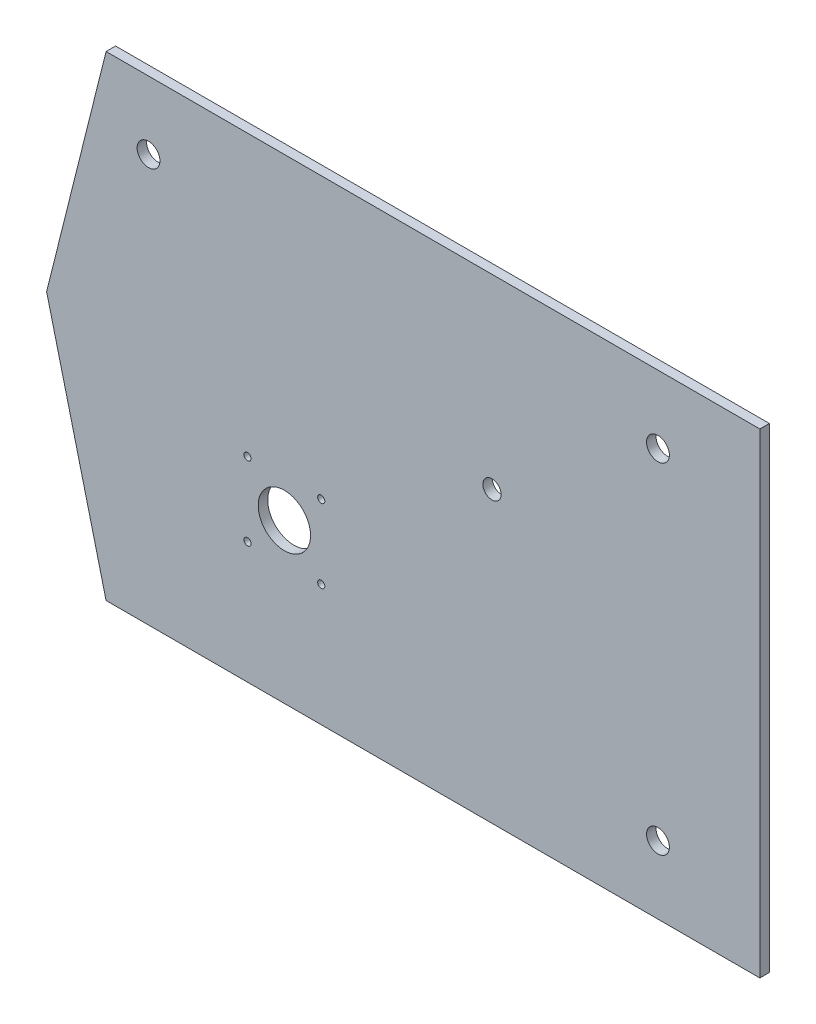
ISO-10303-21;
HEADER;
FILE_DESCRIPTION(('STEP AP214'),'2;1');
FILE_NAME('part.step','',(''),(''),'','','');
FILE_SCHEMA(('AUTOMOTIVE_DESIGN { 1 0 10303 214 1 1 1 1 }'));
ENDSEC;
DATA;
#1=APPLICATION_CONTEXT('core data for automotive mechanical design processes');
#2=APPLICATION_PROTOCOL_DEFINITION('international standard','automotive_design',2000,#1);
#3=PRODUCT_CONTEXT('',#1,'mechanical');
#4=PRODUCT('Part','Part','',(#3));
#5=PRODUCT_RELATED_PRODUCT_CATEGORY('part','',(#4));
#6=PRODUCT_DEFINITION_FORMATION('','',#4);
#7=PRODUCT_DEFINITION_CONTEXT('part definition',#1,'design');
#8=PRODUCT_DEFINITION('design','',#6,#7);
#9=PRODUCT_DEFINITION_SHAPE('','',#8);
#10=(LENGTH_UNIT() NAMED_UNIT(*) SI_UNIT(.MILLI.,.METRE.));
#11=(NAMED_UNIT(*) PLANE_ANGLE_UNIT() SI_UNIT($,.RADIAN.));
#12=(NAMED_UNIT(*) SI_UNIT($,.STERADIAN.) SOLID_ANGLE_UNIT());
#13=UNCERTAINTY_MEASURE_WITH_UNIT(LENGTH_MEASURE(1.E-05),#10,'distance_accuracy_value','');
#14=(GEOMETRIC_REPRESENTATION_CONTEXT(3) GLOBAL_UNCERTAINTY_ASSIGNED_CONTEXT((#13)) GLOBAL_UNIT_ASSIGNED_CONTEXT((#10,
#11,#12)) REPRESENTATION_CONTEXT('',''));
#15=CARTESIAN_POINT('',(0.,0.,0.));
#16=DIRECTION('',(0.,0.,1.));
#17=DIRECTION('',(1.,0.,0.));
#18=AXIS2_PLACEMENT_3D('',#15,#16,#17);
#19=CARTESIAN_POINT('',(-141.176470588235,35.2941176470588,4.));
#20=DIRECTION('',(-0.970142500145332,0.242535625036333,0.));
#21=DIRECTION('',(-0.242535625036333,-0.970142500145332,0.));
#22=AXIS2_PLACEMENT_3D('',#19,#20,#21);
#23=PLANE('',#22);
#24=DIRECTION('',(0.242535625036333,0.970142500145332,0.));
#25=VECTOR('',#24,1.);
#26=CARTESIAN_POINT('',(-141.176470588235,35.2941176470588,0.));
#27=LINE('',#26,#25);
#28=CARTESIAN_POINT('',(-150.,0.,0.));
#29=VERTEX_POINT('',#28);
#30=CARTESIAN_POINT('',(-125.,99.9999999999999,0.));
#31=VERTEX_POINT('',#30);
#32=EDGE_CURVE('E125',#29,#31,#27,.T.);
#33=ORIENTED_EDGE('',*,*,#32,.F.);
#34=DIRECTION('',(0.,0.,-1.));
#35=VECTOR('',#34,1.);
#36=CARTESIAN_POINT('',(-150.,0.,4.));
#37=LINE('',#36,#35);
#38=CARTESIAN_POINT('',(-150.,0.,4.));
#39=VERTEX_POINT('',#38);
#40=EDGE_CURVE('E11',#39,#29,#37,.T.);
#41=ORIENTED_EDGE('',*,*,#40,.F.);
#42=DIRECTION('',(0.242535625036333,0.970142500145332,0.));
#43=VECTOR('',#42,1.);
#44=CARTESIAN_POINT('',(-141.176470588235,35.2941176470588,4.));
#45=LINE('',#44,#43);
#46=CARTESIAN_POINT('',(-125.,99.9999999999999,4.));
#47=VERTEX_POINT('',#46);
#48=EDGE_CURVE('E110',#39,#47,#45,.T.);
#49=ORIENTED_EDGE('',*,*,#48,.T.);
#50=DIRECTION('',(0.,0.,-1.));
#51=VECTOR('',#50,1.);
#52=CARTESIAN_POINT('',(-125.,99.9999999999999,4.));
#53=LINE('',#52,#51);
#54=EDGE_CURVE('E79',#47,#31,#53,.T.);
#55=ORIENTED_EDGE('',*,*,#54,.T.);
#56=EDGE_LOOP('',(#33,#41,#49,#55));
#57=FACE_BOUND('',#56,.T.);
#58=ADVANCED_FACE('F36',(#57),#23,.T.);
#59=CARTESIAN_POINT('',(-141.176470588235,-35.2941176470588,4.));
#60=DIRECTION('',(-0.970142500145332,-0.242535625036333,0.));
#61=DIRECTION('',(0.242535625036333,-0.970142500145332,0.));
#62=AXIS2_PLACEMENT_3D('',#59,#60,#61);
#63=PLANE('',#62);
#64=DIRECTION('',(-0.242535625036333,0.970142500145332,0.));
#65=VECTOR('',#64,1.);
#66=CARTESIAN_POINT('',(-141.176470588235,-35.2941176470588,0.));
#67=LINE('',#66,#65);
#68=CARTESIAN_POINT('',(-125.,-100.,0.));
#69=VERTEX_POINT('',#68);
#70=EDGE_CURVE('E127',#69,#29,#67,.T.);
#71=ORIENTED_EDGE('',*,*,#70,.F.);
#72=DIRECTION('',(0.,0.,-1.));
#73=VECTOR('',#72,1.);
#74=CARTESIAN_POINT('',(-125.,-100.,4.));
#75=LINE('',#74,#73);
#76=CARTESIAN_POINT('',(-125.,-100.,4.));
#77=VERTEX_POINT('',#76);
#78=EDGE_CURVE('E45',#77,#69,#75,.T.);
#79=ORIENTED_EDGE('',*,*,#78,.F.);
#80=DIRECTION('',(-0.242535625036333,0.970142500145332,0.));
#81=VECTOR('',#80,1.);
#82=CARTESIAN_POINT('',(-141.176470588235,-35.2941176470588,4.));
#83=LINE('',#82,#81);
#84=EDGE_CURVE('E108',#77,#39,#83,.T.);
#85=ORIENTED_EDGE('',*,*,#84,.T.);
#86=ORIENTED_EDGE('',*,*,#40,.T.);
#87=EDGE_LOOP('',(#71,#79,#85,#86));
#88=FACE_BOUND('',#87,.T.);
#89=ADVANCED_FACE('F138',(#88),#63,.T.);
#90=CARTESIAN_POINT('',(0.,-100.,4.));
#91=DIRECTION('',(0.,-1.,0.));
#92=DIRECTION('',(1.,0.,0.));
#93=AXIS2_PLACEMENT_3D('',#90,#91,#92);
#94=PLANE('',#93);
#95=DIRECTION('',(-1.,0.,0.));
#96=VECTOR('',#95,1.);
#97=CARTESIAN_POINT('',(0.,-100.,0.));
#98=LINE('',#97,#96);
#99=CARTESIAN_POINT('',(150.,-100.,0.));
#100=VERTEX_POINT('',#99);
#101=EDGE_CURVE('E95',#100,#69,#98,.T.);
#102=ORIENTED_EDGE('',*,*,#101,.F.);
#103=DIRECTION('',(0.,0.,-1.));
#104=VECTOR('',#103,1.);
#105=CARTESIAN_POINT('',(150.,-100.,4.));
#106=LINE('',#105,#104);
#107=CARTESIAN_POINT('',(150.,-100.,4.));
#108=VERTEX_POINT('',#107);
#109=EDGE_CURVE('E89',#108,#100,#106,.T.);
#110=ORIENTED_EDGE('',*,*,#109,.F.);
#111=DIRECTION('',(-1.,0.,0.));
#112=VECTOR('',#111,1.);
#113=CARTESIAN_POINT('',(0.,-100.,4.));
#114=LINE('',#113,#112);
#115=EDGE_CURVE('E93',#108,#77,#114,.T.);
#116=ORIENTED_EDGE('',*,*,#115,.T.);
#117=ORIENTED_EDGE('',*,*,#78,.T.);
#118=EDGE_LOOP('',(#102,#110,#116,#117));
#119=FACE_BOUND('',#118,.T.);
#120=ADVANCED_FACE('F91',(#119),#94,.T.);
#121=CARTESIAN_POINT('',(150.,0.,4.));
#122=DIRECTION('',(-1.,0.,0.));
#123=DIRECTION('',(0.,-1.,0.));
#124=AXIS2_PLACEMENT_3D('',#121,#122,#123);
#125=PLANE('',#124);
#126=DIRECTION('',(0.,1.,0.));
#127=VECTOR('',#126,1.);
#128=CARTESIAN_POINT('',(150.,0.,0.));
#129=LINE('',#128,#127);
#130=CARTESIAN_POINT('',(150.,100.,0.));
#131=VERTEX_POINT('',#130);
#132=EDGE_CURVE('E131',#100,#131,#129,.T.);
#133=ORIENTED_EDGE('',*,*,#132,.T.);
#134=DIRECTION('',(0.,0.,-1.));
#135=VECTOR('',#134,1.);
#136=CARTESIAN_POINT('',(150.,100.,4.));
#137=LINE('',#136,#135);
#138=CARTESIAN_POINT('',(150.,100.,4.));
#139=VERTEX_POINT('',#138);
#140=EDGE_CURVE('E98',#139,#131,#137,.T.);
#141=ORIENTED_EDGE('',*,*,#140,.F.);
#142=DIRECTION('',(0.,1.,0.));
#143=VECTOR('',#142,1.);
#144=CARTESIAN_POINT('',(150.,0.,4.));
#145=LINE('',#144,#143);
#146=EDGE_CURVE('E101',#108,#139,#145,.T.);
#147=ORIENTED_EDGE('',*,*,#146,.F.);
#148=ORIENTED_EDGE('',*,*,#109,.T.);
#149=EDGE_LOOP('',(#133,#141,#147,#148));
#150=FACE_BOUND('',#149,.T.);
#151=ADVANCED_FACE('F102',(#150),#125,.F.);
#152=CARTESIAN_POINT('',(107.142857142857,71.4285714285714,4.));
#153=DIRECTION('',(0.,0.,-1.));
#154=DIRECTION('',(-1.,0.,0.));
#155=AXIS2_PLACEMENT_3D('',#152,#153,#154);
#156=CYLINDRICAL_SURFACE('',#155,4.8);
#157=CARTESIAN_POINT('',(107.142857142857,71.4285714285714,4.));
#158=DIRECTION('',(0.,0.,1.));
#159=DIRECTION('',(1.,0.,0.));
#160=AXIS2_PLACEMENT_3D('',#157,#158,#159);
#161=CIRCLE('',#160,4.8);
#162=CARTESIAN_POINT('',(111.942857142857,71.4285714285714,4.));
#163=VERTEX_POINT('',#162);
#164=EDGE_CURVE('E198',#163,#163,#161,.T.);
#165=ORIENTED_EDGE('',*,*,#164,.T.);
#166=EDGE_LOOP('',(#165));
#167=FACE_BOUND('',#166,.T.);
#168=CARTESIAN_POINT('',(107.142857142857,71.4285714285714,0.));
#169=DIRECTION('',(0.,0.,1.));
#170=DIRECTION('',(1.,0.,0.));
#171=AXIS2_PLACEMENT_3D('',#168,#169,#170);
#172=CIRCLE('',#171,4.8);
#173=CARTESIAN_POINT('',(111.942857142857,71.4285714285714,0.));
#174=VERTEX_POINT('',#173);
#175=EDGE_CURVE('E122',#174,#174,#172,.T.);
#176=ORIENTED_EDGE('',*,*,#175,.F.);
#177=EDGE_LOOP('',(#176));
#178=FACE_BOUND('',#177,.T.);
#179=ADVANCED_FACE('F208',(#167,#178),#156,.F.);
#180=CARTESIAN_POINT('',(107.142857142857,-71.4285714285714,4.));
#181=DIRECTION('',(0.,0.,-1.));
#182=DIRECTION('',(-1.,0.,0.));
#183=AXIS2_PLACEMENT_3D('',#180,#181,#182);
#184=CYLINDRICAL_SURFACE('',#183,4.8);
#185=CARTESIAN_POINT('',(107.142857142857,-71.4285714285714,4.));
#186=DIRECTION('',(0.,0.,1.));
#187=DIRECTION('',(1.,0.,0.));
#188=AXIS2_PLACEMENT_3D('',#185,#186,#187);
#189=CIRCLE('',#188,4.8);
#190=CARTESIAN_POINT('',(111.942857142857,-71.4285714285714,4.));
#191=VERTEX_POINT('',#190);
#192=EDGE_CURVE('E195',#191,#191,#189,.T.);
#193=ORIENTED_EDGE('',*,*,#192,.T.);
#194=EDGE_LOOP('',(#193));
#195=FACE_BOUND('',#194,.T.);
#196=CARTESIAN_POINT('',(107.142857142857,-71.4285714285714,0.));
#197=DIRECTION('',(0.,0.,1.));
#198=DIRECTION('',(1.,0.,0.));
#199=AXIS2_PLACEMENT_3D('',#196,#197,#198);
#200=CIRCLE('',#199,4.8);
#201=CARTESIAN_POINT('',(111.942857142857,-71.4285714285714,0.));
#202=VERTEX_POINT('',#201);
#203=EDGE_CURVE('E118',#202,#202,#200,.T.);
#204=ORIENTED_EDGE('',*,*,#203,.F.);
#205=EDGE_LOOP('',(#204));
#206=FACE_BOUND('',#205,.T.);
#207=ADVANCED_FACE('F210',(#195,#206),#184,.F.);
#208=CARTESIAN_POINT('',(-107.142857142857,71.4285714285713,4.));
#209=DIRECTION('',(0.,0.,-1.));
#210=DIRECTION('',(-1.,0.,0.));
#211=AXIS2_PLACEMENT_3D('',#208,#209,#210);
#212=CYLINDRICAL_SURFACE('',#211,4.8);
#213=CARTESIAN_POINT('',(-107.142857142857,71.4285714285713,4.));
#214=DIRECTION('',(0.,0.,1.));
#215=DIRECTION('',(1.,0.,0.));
#216=AXIS2_PLACEMENT_3D('',#213,#214,#215);
#217=CIRCLE('',#216,4.8);
#218=CARTESIAN_POINT('',(-102.342857142857,71.4285714285713,4.));
#219=VERTEX_POINT('',#218);
#220=EDGE_CURVE('E134',#219,#219,#217,.T.);
#221=ORIENTED_EDGE('',*,*,#220,.T.);
#222=EDGE_LOOP('',(#221));
#223=FACE_BOUND('',#222,.T.);
#224=CARTESIAN_POINT('',(-107.142857142857,71.4285714285713,0.));
#225=DIRECTION('',(0.,0.,1.));
#226=DIRECTION('',(1.,0.,0.));
#227=AXIS2_PLACEMENT_3D('',#224,#225,#226);
#228=CIRCLE('',#227,4.8);
#229=CARTESIAN_POINT('',(-102.342857142857,71.4285714285713,0.));
#230=VERTEX_POINT('',#229);
#231=EDGE_CURVE('E115',#230,#230,#228,.T.);
#232=ORIENTED_EDGE('',*,*,#231,.F.);
#233=EDGE_LOOP('',(#232));
#234=FACE_BOUND('',#233,.T.);
#235=ADVANCED_FACE('F38',(#223,#234),#212,.F.);
#236=CARTESIAN_POINT('',(0.,100.,4.));
#237=DIRECTION('',(0.,-1.,0.));
#238=DIRECTION('',(1.,0.,0.));
#239=AXIS2_PLACEMENT_3D('',#236,#237,#238);
#240=PLANE('',#239);
#241=DIRECTION('',(-1.,0.,0.));
#242=VECTOR('',#241,1.);
#243=CARTESIAN_POINT('',(0.,100.,0.));
#244=LINE('',#243,#242);
#245=EDGE_CURVE('E72',#131,#31,#244,.T.);
#246=ORIENTED_EDGE('',*,*,#245,.T.);
#247=ORIENTED_EDGE('',*,*,#54,.F.);
#248=DIRECTION('',(-1.,0.,0.));
#249=VECTOR('',#248,1.);
#250=CARTESIAN_POINT('',(0.,100.,4.));
#251=LINE('',#250,#249);
#252=EDGE_CURVE('E53',#139,#47,#251,.T.);
#253=ORIENTED_EDGE('',*,*,#252,.F.);
#254=ORIENTED_EDGE('',*,*,#140,.T.);
#255=EDGE_LOOP('',(#246,#247,#253,#254));
#256=FACE_BOUND('',#255,.T.);
#257=ADVANCED_FACE('F217',(#256),#240,.F.);
#258=CARTESIAN_POINT('',(0.,0.,4.));
#259=DIRECTION('',(0.,0.,1.));
#260=DIRECTION('',(1.,0.,0.));
#261=AXIS2_PLACEMENT_3D('',#258,#259,#260);
#262=PLANE('',#261);
#263=ORIENTED_EDGE('',*,*,#220,.F.);
#264=EDGE_LOOP('',(#263));
#265=FACE_BOUND('',#264,.T.);
#266=ORIENTED_EDGE('',*,*,#192,.F.);
#267=EDGE_LOOP('',(#266));
#268=FACE_BOUND('',#267,.T.);
#269=ORIENTED_EDGE('',*,*,#164,.F.);
#270=EDGE_LOOP('',(#269));
#271=FACE_BOUND('',#270,.T.);
#272=ORIENTED_EDGE('',*,*,#48,.F.);
#273=ORIENTED_EDGE('',*,*,#84,.F.);
#274=ORIENTED_EDGE('',*,*,#115,.F.);
#275=ORIENTED_EDGE('',*,*,#146,.T.);
#276=ORIENTED_EDGE('',*,*,#252,.T.);
#277=EDGE_LOOP('',(#272,#273,#274,#275,#276));
#278=FACE_BOUND('',#277,.T.);
#279=CARTESIAN_POINT('',(-50.,-33.3333333333334,4.));
#280=DIRECTION('',(0.,0.,1.));
#281=DIRECTION('',(1.,0.,0.));
#282=AXIS2_PLACEMENT_3D('',#279,#280,#281);
#283=CIRCLE('',#282,11.);
#284=CARTESIAN_POINT('',(-39.,-33.3333333333334,4.));
#285=VERTEX_POINT('',#284);
#286=EDGE_CURVE('E174',#285,#285,#283,.T.);
#287=ORIENTED_EDGE('',*,*,#286,.F.);
#288=EDGE_LOOP('',(#287));
#289=FACE_BOUND('',#288,.T.);
#290=CARTESIAN_POINT('',(-65.5000000000001,-48.8333333333333,4.));
#291=DIRECTION('',(0.,0.,1.));
#292=DIRECTION('',(1.,0.,0.));
#293=AXIS2_PLACEMENT_3D('',#290,#291,#292);
#294=CIRCLE('',#293,1.50000000000003);
#295=CARTESIAN_POINT('',(-64.,-48.8333333333333,4.));
#296=VERTEX_POINT('',#295);
#297=EDGE_CURVE('E177',#296,#296,#294,.T.);
#298=ORIENTED_EDGE('',*,*,#297,.F.);
#299=EDGE_LOOP('',(#298));
#300=FACE_BOUND('',#299,.T.);
#301=CARTESIAN_POINT('',(-34.5,-48.8333333333333,4.));
#302=DIRECTION('',(0.,0.,1.));
#303=DIRECTION('',(1.,0.,0.));
#304=AXIS2_PLACEMENT_3D('',#301,#302,#303);
#305=CIRCLE('',#304,1.50000000000003);
#306=CARTESIAN_POINT('',(-33.,-48.8333333333333,4.));
#307=VERTEX_POINT('',#306);
#308=EDGE_CURVE('E180',#307,#307,#305,.T.);
#309=ORIENTED_EDGE('',*,*,#308,.F.);
#310=EDGE_LOOP('',(#309));
#311=FACE_BOUND('',#310,.T.);
#312=CARTESIAN_POINT('',(-34.5,-17.8333333333333,4.));
#313=DIRECTION('',(0.,0.,1.));
#314=DIRECTION('',(1.,0.,0.));
#315=AXIS2_PLACEMENT_3D('',#312,#313,#314);
#316=CIRCLE('',#315,1.50000000000003);
#317=CARTESIAN_POINT('',(-33.,-17.8333333333333,4.));
#318=VERTEX_POINT('',#317);
#319=EDGE_CURVE('E183',#318,#318,#316,.T.);
#320=ORIENTED_EDGE('',*,*,#319,.F.);
#321=EDGE_LOOP('',(#320));
#322=FACE_BOUND('',#321,.T.);
#323=CARTESIAN_POINT('',(-65.5000000000001,-17.8333333333333,4.));
#324=DIRECTION('',(0.,0.,1.));
#325=DIRECTION('',(1.,0.,0.));
#326=AXIS2_PLACEMENT_3D('',#323,#324,#325);
#327=CIRCLE('',#326,1.50000000000003);
#328=CARTESIAN_POINT('',(-64.,-17.8333333333333,4.));
#329=VERTEX_POINT('',#328);
#330=EDGE_CURVE('E119',#329,#329,#327,.T.);
#331=ORIENTED_EDGE('',*,*,#330,.F.);
#332=EDGE_LOOP('',(#331));
#333=FACE_BOUND('',#332,.T.);
#334=CARTESIAN_POINT('',(37.332408691632,21.6520265063954,4.));
#335=DIRECTION('',(0.,0.,1.));
#336=DIRECTION('',(1.,0.,0.));
#337=AXIS2_PLACEMENT_3D('',#334,#335,#336);
#338=CIRCLE('',#337,3.85);
#339=CARTESIAN_POINT('',(41.182408691632,21.6520265063954,4.));
#340=VERTEX_POINT('',#339);
#341=EDGE_CURVE('E169',#340,#340,#338,.T.);
#342=ORIENTED_EDGE('',*,*,#341,.F.);
#343=EDGE_LOOP('',(#342));
#344=FACE_BOUND('',#343,.T.);
#345=ADVANCED_FACE('F105',(#265,#268,#271,#278,#289,#300,#311,#322,#333,#344),#262,.T.);
#346=CARTESIAN_POINT('',(0.,0.,0.));
#347=DIRECTION('',(0.,0.,1.));
#348=DIRECTION('',(1.,0.,0.));
#349=AXIS2_PLACEMENT_3D('',#346,#347,#348);
#350=PLANE('',#349);
#351=ORIENTED_EDGE('',*,*,#231,.T.);
#352=EDGE_LOOP('',(#351));
#353=FACE_BOUND('',#352,.T.);
#354=ORIENTED_EDGE('',*,*,#203,.T.);
#355=EDGE_LOOP('',(#354));
#356=FACE_BOUND('',#355,.T.);
#357=ORIENTED_EDGE('',*,*,#175,.T.);
#358=EDGE_LOOP('',(#357));
#359=FACE_BOUND('',#358,.T.);
#360=ORIENTED_EDGE('',*,*,#32,.T.);
#361=ORIENTED_EDGE('',*,*,#245,.F.);
#362=ORIENTED_EDGE('',*,*,#132,.F.);
#363=ORIENTED_EDGE('',*,*,#101,.T.);
#364=ORIENTED_EDGE('',*,*,#70,.T.);
#365=EDGE_LOOP('',(#360,#361,#362,#363,#364));
#366=FACE_BOUND('',#365,.T.);
#367=CARTESIAN_POINT('',(-50.,-33.3333333333334,0.));
#368=DIRECTION('',(0.,0.,1.));
#369=DIRECTION('',(1.,0.,0.));
#370=AXIS2_PLACEMENT_3D('',#367,#368,#369);
#371=CIRCLE('',#370,11.);
#372=CARTESIAN_POINT('',(-39.,-33.3333333333334,0.));
#373=VERTEX_POINT('',#372);
#374=EDGE_CURVE('E148',#373,#373,#371,.T.);
#375=ORIENTED_EDGE('',*,*,#374,.T.);
#376=EDGE_LOOP('',(#375));
#377=FACE_BOUND('',#376,.T.);
#378=CARTESIAN_POINT('',(-65.5000000000001,-48.8333333333333,0.));
#379=DIRECTION('',(0.,0.,1.));
#380=DIRECTION('',(1.,0.,0.));
#381=AXIS2_PLACEMENT_3D('',#378,#379,#380);
#382=CIRCLE('',#381,1.50000000000003);
#383=CARTESIAN_POINT('',(-64.,-48.8333333333333,0.));
#384=VERTEX_POINT('',#383);
#385=EDGE_CURVE('E152',#384,#384,#382,.T.);
#386=ORIENTED_EDGE('',*,*,#385,.T.);
#387=EDGE_LOOP('',(#386));
#388=FACE_BOUND('',#387,.T.);
#389=CARTESIAN_POINT('',(-34.5,-48.8333333333333,0.));
#390=DIRECTION('',(0.,0.,1.));
#391=DIRECTION('',(1.,0.,0.));
#392=AXIS2_PLACEMENT_3D('',#389,#390,#391);
#393=CIRCLE('',#392,1.50000000000003);
#394=CARTESIAN_POINT('',(-33.,-48.8333333333333,0.));
#395=VERTEX_POINT('',#394);
#396=EDGE_CURVE('E156',#395,#395,#393,.T.);
#397=ORIENTED_EDGE('',*,*,#396,.T.);
#398=EDGE_LOOP('',(#397));
#399=FACE_BOUND('',#398,.T.);
#400=CARTESIAN_POINT('',(-34.5,-17.8333333333333,0.));
#401=DIRECTION('',(0.,0.,1.));
#402=DIRECTION('',(1.,0.,0.));
#403=AXIS2_PLACEMENT_3D('',#400,#401,#402);
#404=CIRCLE('',#403,1.50000000000003);
#405=CARTESIAN_POINT('',(-33.,-17.8333333333333,0.));
#406=VERTEX_POINT('',#405);
#407=EDGE_CURVE('E160',#406,#406,#404,.T.);
#408=ORIENTED_EDGE('',*,*,#407,.T.);
#409=EDGE_LOOP('',(#408));
#410=FACE_BOUND('',#409,.T.);
#411=CARTESIAN_POINT('',(-65.5000000000001,-17.8333333333333,0.));
#412=DIRECTION('',(0.,0.,1.));
#413=DIRECTION('',(1.,0.,0.));
#414=AXIS2_PLACEMENT_3D('',#411,#412,#413);
#415=CIRCLE('',#414,1.50000000000003);
#416=CARTESIAN_POINT('',(-64.,-17.8333333333333,0.));
#417=VERTEX_POINT('',#416);
#418=EDGE_CURVE('E164',#417,#417,#415,.T.);
#419=ORIENTED_EDGE('',*,*,#418,.T.);
#420=EDGE_LOOP('',(#419));
#421=FACE_BOUND('',#420,.T.);
#422=CARTESIAN_POINT('',(37.332408691632,21.6520265063954,0.));
#423=DIRECTION('',(0.,0.,1.));
#424=DIRECTION('',(1.,0.,0.));
#425=AXIS2_PLACEMENT_3D('',#422,#423,#424);
#426=CIRCLE('',#425,3.85);
#427=CARTESIAN_POINT('',(41.182408691632,21.6520265063954,0.));
#428=VERTEX_POINT('',#427);
#429=EDGE_CURVE('E167',#428,#428,#426,.T.);
#430=ORIENTED_EDGE('',*,*,#429,.T.);
#431=EDGE_LOOP('',(#430));
#432=FACE_BOUND('',#431,.T.);
#433=ADVANCED_FACE('F139',(#353,#356,#359,#366,#377,#388,#399,#410,#421,#432),#350,.F.);
#434=CARTESIAN_POINT('',(-34.5,-17.8333333333333,4.));
#435=DIRECTION('',(0.,0.,-1.));
#436=DIRECTION('',(-1.,0.,0.));
#437=AXIS2_PLACEMENT_3D('',#434,#435,#436);
#438=CYLINDRICAL_SURFACE('',#437,1.50000000000003);
#439=ORIENTED_EDGE('',*,*,#319,.T.);
#440=EDGE_LOOP('',(#439));
#441=FACE_BOUND('',#440,.T.);
#442=ORIENTED_EDGE('',*,*,#407,.F.);
#443=EDGE_LOOP('',(#442));
#444=FACE_BOUND('',#443,.T.);
#445=ADVANCED_FACE('F142',(#441,#444),#438,.F.);
#446=CARTESIAN_POINT('',(-34.5,-48.8333333333333,4.));
#447=DIRECTION('',(0.,0.,-1.));
#448=DIRECTION('',(-1.,0.,0.));
#449=AXIS2_PLACEMENT_3D('',#446,#447,#448);
#450=CYLINDRICAL_SURFACE('',#449,1.50000000000003);
#451=ORIENTED_EDGE('',*,*,#308,.T.);
#452=EDGE_LOOP('',(#451));
#453=FACE_BOUND('',#452,.T.);
#454=ORIENTED_EDGE('',*,*,#396,.F.);
#455=EDGE_LOOP('',(#454));
#456=FACE_BOUND('',#455,.T.);
#457=ADVANCED_FACE('F282',(#453,#456),#450,.F.);
#458=CARTESIAN_POINT('',(-65.5000000000001,-48.8333333333333,4.));
#459=DIRECTION('',(0.,0.,-1.));
#460=DIRECTION('',(-1.,0.,0.));
#461=AXIS2_PLACEMENT_3D('',#458,#459,#460);
#462=CYLINDRICAL_SURFACE('',#461,1.50000000000003);
#463=ORIENTED_EDGE('',*,*,#297,.T.);
#464=EDGE_LOOP('',(#463));
#465=FACE_BOUND('',#464,.T.);
#466=ORIENTED_EDGE('',*,*,#385,.F.);
#467=EDGE_LOOP('',(#466));
#468=FACE_BOUND('',#467,.T.);
#469=ADVANCED_FACE('F293',(#465,#468),#462,.F.);
#470=CARTESIAN_POINT('',(-50.,-33.3333333333334,4.));
#471=DIRECTION('',(0.,0.,-1.));
#472=DIRECTION('',(-1.,0.,0.));
#473=AXIS2_PLACEMENT_3D('',#470,#471,#472);
#474=CYLINDRICAL_SURFACE('',#473,11.);
#475=ORIENTED_EDGE('',*,*,#286,.T.);
#476=EDGE_LOOP('',(#475));
#477=FACE_BOUND('',#476,.T.);
#478=ORIENTED_EDGE('',*,*,#374,.F.);
#479=EDGE_LOOP('',(#478));
#480=FACE_BOUND('',#479,.T.);
#481=ADVANCED_FACE('F239',(#477,#480),#474,.F.);
#482=CARTESIAN_POINT('',(-65.5000000000001,-17.8333333333333,4.));
#483=DIRECTION('',(0.,0.,-1.));
#484=DIRECTION('',(-1.,0.,0.));
#485=AXIS2_PLACEMENT_3D('',#482,#483,#484);
#486=CYLINDRICAL_SURFACE('',#485,1.50000000000003);
#487=ORIENTED_EDGE('',*,*,#330,.T.);
#488=EDGE_LOOP('',(#487));
#489=FACE_BOUND('',#488,.T.);
#490=ORIENTED_EDGE('',*,*,#418,.F.);
#491=EDGE_LOOP('',(#490));
#492=FACE_BOUND('',#491,.T.);
#493=ADVANCED_FACE('F311',(#489,#492),#486,.F.);
#494=CARTESIAN_POINT('',(37.332408691632,21.6520265063954,4.));
#495=DIRECTION('',(0.,0.,-1.));
#496=DIRECTION('',(-1.,0.,0.));
#497=AXIS2_PLACEMENT_3D('',#494,#495,#496);
#498=CYLINDRICAL_SURFACE('',#497,3.85);
#499=ORIENTED_EDGE('',*,*,#341,.T.);
#500=EDGE_LOOP('',(#499));
#501=FACE_BOUND('',#500,.T.);
#502=ORIENTED_EDGE('',*,*,#429,.F.);
#503=EDGE_LOOP('',(#502));
#504=FACE_BOUND('',#503,.T.);
#505=ADVANCED_FACE('F320',(#501,#504),#498,.F.);
#506=CLOSED_SHELL('',(#58,#89,#120,#151,#179,#207,#235,#257,#345,#433,#445,#457,#469,#481,#493,#505));
#507=MANIFOLD_SOLID_BREP('B2',#506);
#508=ADVANCED_BREP_SHAPE_REPRESENTATION('',(#18,#507),#14);
#509=SHAPE_DEFINITION_REPRESENTATION(#9,#508);
ENDSEC;
END-ISO-10303-21;
